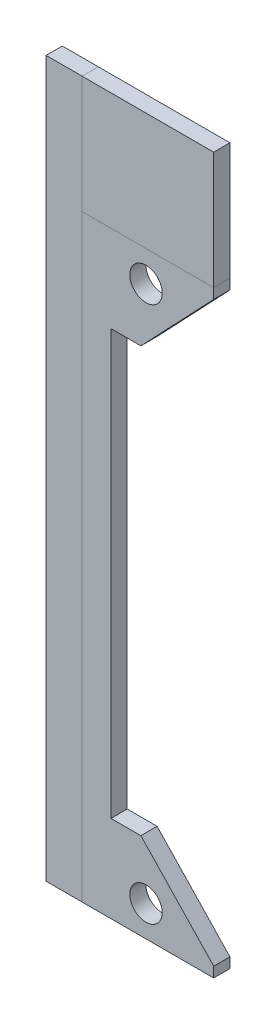
ISO-10303-21;
HEADER;
FILE_DESCRIPTION(('STEP AP214'),'2;1');
FILE_NAME('part.step','',(''),(''),'','','');
FILE_SCHEMA(('AUTOMOTIVE_DESIGN { 1 0 10303 214 1 1 1 1 }'));
ENDSEC;
DATA;
#1=APPLICATION_CONTEXT('core data for automotive mechanical design processes');
#2=APPLICATION_PROTOCOL_DEFINITION('international standard','automotive_design',2000,#1);
#3=PRODUCT_CONTEXT('',#1,'mechanical');
#4=PRODUCT('Part','Part','',(#3));
#5=PRODUCT_RELATED_PRODUCT_CATEGORY('part','',(#4));
#6=PRODUCT_DEFINITION_FORMATION('','',#4);
#7=PRODUCT_DEFINITION_CONTEXT('part definition',#1,'design');
#8=PRODUCT_DEFINITION('design','',#6,#7);
#9=PRODUCT_DEFINITION_SHAPE('','',#8);
#10=(LENGTH_UNIT() NAMED_UNIT(*) SI_UNIT(.MILLI.,.METRE.));
#11=(NAMED_UNIT(*) PLANE_ANGLE_UNIT() SI_UNIT($,.RADIAN.));
#12=(NAMED_UNIT(*) SI_UNIT($,.STERADIAN.) SOLID_ANGLE_UNIT());
#13=UNCERTAINTY_MEASURE_WITH_UNIT(LENGTH_MEASURE(1.E-05),#10,'distance_accuracy_value','');
#14=(GEOMETRIC_REPRESENTATION_CONTEXT(3) GLOBAL_UNCERTAINTY_ASSIGNED_CONTEXT((#13)) GLOBAL_UNIT_ASSIGNED_CONTEXT((#10,
#11,#12)) REPRESENTATION_CONTEXT('',''));
#15=CARTESIAN_POINT('',(0.,0.,0.));
#16=DIRECTION('',(0.,0.,1.));
#17=DIRECTION('',(1.,0.,0.));
#18=AXIS2_PLACEMENT_3D('',#15,#16,#17);
#19=CARTESIAN_POINT('',(0.,0.,3.17499999999992));
#20=DIRECTION('',(0.,0.,-1.));
#21=DIRECTION('',(-1.,0.,0.));
#22=AXIS2_PLACEMENT_3D('',#19,#20,#21);
#23=PLANE('',#22);
#24=DIRECTION('',(0.,1.,0.));
#25=VECTOR('',#24,1.);
#26=CARTESIAN_POINT('',(-490.,1.49999999999986,3.17499999999997));
#27=LINE('',#26,#25);
#28=CARTESIAN_POINT('',(-490.,1.49999999999986,3.17499999999997));
#29=VERTEX_POINT('',#28);
#30=CARTESIAN_POINT('',(-490.,141.459761952969,3.17499999999996));
#31=VERTEX_POINT('',#30);
#32=EDGE_CURVE('E240',#29,#31,#27,.T.);
#33=ORIENTED_EDGE('',*,*,#32,.T.);
#34=DIRECTION('',(-1.,0.,0.));
#35=VECTOR('',#34,1.);
#36=CARTESIAN_POINT('',(-490.,141.459761952969,3.17499999999996));
#37=LINE('',#36,#35);
#38=CARTESIAN_POINT('',(-497.05,141.459761952969,3.17499999999988));
#39=VERTEX_POINT('',#38);
#40=EDGE_CURVE('E246',#31,#39,#37,.T.);
#41=ORIENTED_EDGE('',*,*,#40,.T.);
#42=DIRECTION('',(0.,1.,0.));
#43=VECTOR('',#42,1.);
#44=CARTESIAN_POINT('',(-497.05,1.49999999999986,3.17499999999995));
#45=LINE('',#44,#43);
#46=CARTESIAN_POINT('',(-497.05,1.49999999999986,3.17499999999995));
#47=VERTEX_POINT('',#46);
#48=EDGE_CURVE('E270',#47,#39,#45,.T.);
#49=ORIENTED_EDGE('',*,*,#48,.F.);
#50=DIRECTION('',(-1.,0.,0.));
#51=VECTOR('',#50,1.);
#52=CARTESIAN_POINT('',(-490.,1.49999999999986,3.17499999999997));
#53=LINE('',#52,#51);
#54=EDGE_CURVE('E220',#29,#47,#53,.T.);
#55=ORIENTED_EDGE('',*,*,#54,.F.);
#56=EDGE_LOOP('',(#33,#41,#49,#55));
#57=FACE_BOUND('',#56,.T.);
#58=ADVANCED_FACE('F211',(#57),#23,.F.);
#59=CARTESIAN_POINT('',(0.,0.,0.));
#60=DIRECTION('',(0.,0.,-1.));
#61=DIRECTION('',(-1.,0.,0.));
#62=AXIS2_PLACEMENT_3D('',#59,#60,#61);
#63=PLANE('',#62);
#64=DIRECTION('',(0.,1.,0.));
#65=VECTOR('',#64,1.);
#66=CARTESIAN_POINT('',(-490.,1.49999999999986,0.));
#67=LINE('',#66,#65);
#68=CARTESIAN_POINT('',(-490.,1.49999999999986,0.));
#69=VERTEX_POINT('',#68);
#70=CARTESIAN_POINT('',(-490.,141.459761952969,0.));
#71=VERTEX_POINT('',#70);
#72=EDGE_CURVE('E228',#69,#71,#67,.T.);
#73=ORIENTED_EDGE('',*,*,#72,.F.);
#74=DIRECTION('',(-1.,0.,0.));
#75=VECTOR('',#74,1.);
#76=CARTESIAN_POINT('',(-490.,1.49999999999986,0.));
#77=LINE('',#76,#75);
#78=CARTESIAN_POINT('',(-497.05,1.49999999999986,0.));
#79=VERTEX_POINT('',#78);
#80=EDGE_CURVE('E13',#69,#79,#77,.T.);
#81=ORIENTED_EDGE('',*,*,#80,.T.);
#82=DIRECTION('',(0.,1.,0.));
#83=VECTOR('',#82,1.);
#84=CARTESIAN_POINT('',(-497.05,1.49999999999986,0.));
#85=LINE('',#84,#83);
#86=CARTESIAN_POINT('',(-497.05,141.459761952969,-1.19307173844465E-13));
#87=VERTEX_POINT('',#86);
#88=EDGE_CURVE('E255',#79,#87,#85,.T.);
#89=ORIENTED_EDGE('',*,*,#88,.T.);
#90=DIRECTION('',(-1.,0.,0.));
#91=VECTOR('',#90,1.);
#92=CARTESIAN_POINT('',(-490.,141.459761952969,0.));
#93=LINE('',#92,#91);
#94=EDGE_CURVE('E288',#71,#87,#93,.T.);
#95=ORIENTED_EDGE('',*,*,#94,.F.);
#96=EDGE_LOOP('',(#73,#81,#89,#95));
#97=FACE_BOUND('',#96,.T.);
#98=ADVANCED_FACE('F254',(#97),#63,.T.);
#99=CARTESIAN_POINT('',(-490.,1.49999999999986,0.));
#100=DIRECTION('',(1.,0.,0.));
#101=DIRECTION('',(0.,1.,0.));
#102=AXIS2_PLACEMENT_3D('',#99,#100,#101);
#103=PLANE('',#102);
#104=ORIENTED_EDGE('',*,*,#32,.F.);
#105=DIRECTION('',(0.,0.,1.));
#106=VECTOR('',#105,1.);
#107=CARTESIAN_POINT('',(-490.,1.49999999999986,0.));
#108=LINE('',#107,#106);
#109=EDGE_CURVE('E282',#69,#29,#108,.T.);
#110=ORIENTED_EDGE('',*,*,#109,.F.);
#111=ORIENTED_EDGE('',*,*,#72,.T.);
#112=DIRECTION('',(0.,0.,1.));
#113=VECTOR('',#112,1.);
#114=CARTESIAN_POINT('',(-490.,141.459761952969,0.));
#115=LINE('',#114,#113);
#116=EDGE_CURVE('E295',#71,#31,#115,.T.);
#117=ORIENTED_EDGE('',*,*,#116,.T.);
#118=EDGE_LOOP('',(#104,#110,#111,#117));
#119=FACE_BOUND('',#118,.T.);
#120=ADVANCED_FACE('F307',(#119),#103,.T.);
#121=CARTESIAN_POINT('',(-490.,141.459761952969,0.));
#122=DIRECTION('',(0.,1.,0.));
#123=DIRECTION('',(0.,0.,1.));
#124=AXIS2_PLACEMENT_3D('',#121,#122,#123);
#125=PLANE('',#124);
#126=ORIENTED_EDGE('',*,*,#40,.F.);
#127=ORIENTED_EDGE('',*,*,#116,.F.);
#128=ORIENTED_EDGE('',*,*,#94,.T.);
#129=DIRECTION('',(0.,0.,1.));
#130=VECTOR('',#129,1.);
#131=CARTESIAN_POINT('',(-497.05,141.459761952969,-1.19307173844465E-13));
#132=LINE('',#131,#130);
#133=EDGE_CURVE('E266',#87,#39,#132,.T.);
#134=ORIENTED_EDGE('',*,*,#133,.T.);
#135=EDGE_LOOP('',(#126,#127,#128,#134));
#136=FACE_BOUND('',#135,.T.);
#137=ADVANCED_FACE('F309',(#136),#125,.T.);
#138=CARTESIAN_POINT('',(-490.,1.49999999999986,0.));
#139=DIRECTION('',(0.,1.,0.));
#140=DIRECTION('',(0.,0.,1.));
#141=AXIS2_PLACEMENT_3D('',#138,#139,#140);
#142=PLANE('',#141);
#143=ORIENTED_EDGE('',*,*,#54,.T.);
#144=DIRECTION('',(0.,0.,1.));
#145=VECTOR('',#144,1.);
#146=CARTESIAN_POINT('',(-497.05,1.49999999999986,0.));
#147=LINE('',#146,#145);
#148=EDGE_CURVE('E264',#79,#47,#147,.T.);
#149=ORIENTED_EDGE('',*,*,#148,.F.);
#150=ORIENTED_EDGE('',*,*,#80,.F.);
#151=ORIENTED_EDGE('',*,*,#109,.T.);
#152=EDGE_LOOP('',(#143,#149,#150,#151));
#153=FACE_BOUND('',#152,.T.);
#154=ADVANCED_FACE('F269',(#153),#142,.F.);
#155=CARTESIAN_POINT('',(-497.05,1.49999999999986,0.));
#156=DIRECTION('',(1.,0.,0.));
#157=DIRECTION('',(0.,0.,-1.));
#158=AXIS2_PLACEMENT_3D('',#155,#156,#157);
#159=PLANE('',#158);
#160=ORIENTED_EDGE('',*,*,#48,.T.);
#161=ORIENTED_EDGE('',*,*,#133,.F.);
#162=ORIENTED_EDGE('',*,*,#88,.F.);
#163=ORIENTED_EDGE('',*,*,#148,.T.);
#164=EDGE_LOOP('',(#160,#161,#162,#163));
#165=FACE_BOUND('',#164,.T.);
#166=ADVANCED_FACE('F263',(#165),#159,.F.);
#167=CLOSED_SHELL('',(#58,#98,#120,#137,#154,#166));
#168=MANIFOLD_SOLID_BREP('B2',#167);
#169=CARTESIAN_POINT('',(0.,0.,3.17499999999997));
#170=DIRECTION('',(0.,0.,-1.));
#171=DIRECTION('',(-1.,0.,0.));
#172=AXIS2_PLACEMENT_3D('',#169,#170,#171);
#173=PLANE('',#172);
#174=DIRECTION('',(0.,1.,0.));
#175=VECTOR('',#174,1.);
#176=CARTESIAN_POINT('',(-490.,118.5,3.17499999999997));
#177=LINE('',#176,#175);
#178=CARTESIAN_POINT('',(-490.,118.5,3.17499999999997));
#179=VERTEX_POINT('',#178);
#180=CARTESIAN_POINT('',(-490.,141.459761952969,3.17499999999996));
#181=VERTEX_POINT('',#180);
#182=EDGE_CURVE('E408',#179,#181,#177,.T.);
#183=ORIENTED_EDGE('',*,*,#182,.F.);
#184=DIRECTION('',(1.,0.,0.));
#185=VECTOR('',#184,1.);
#186=CARTESIAN_POINT('',(-490.,118.5,3.17499999999997));
#187=LINE('',#186,#185);
#188=CARTESIAN_POINT('',(-464.25,118.5,3.17499999999997));
#189=VERTEX_POINT('',#188);
#190=EDGE_CURVE('E415',#179,#189,#187,.T.);
#191=ORIENTED_EDGE('',*,*,#190,.T.);
#192=DIRECTION('',(0.,1.,0.));
#193=VECTOR('',#192,1.);
#194=CARTESIAN_POINT('',(-464.25,118.5,3.17499999999997));
#195=LINE('',#194,#193);
#196=CARTESIAN_POINT('',(-464.25,141.459761952969,3.17499999999998));
#197=VERTEX_POINT('',#196);
#198=EDGE_CURVE('E440',#189,#197,#195,.T.);
#199=ORIENTED_EDGE('',*,*,#198,.T.);
#200=DIRECTION('',(1.,0.,0.));
#201=VECTOR('',#200,1.);
#202=CARTESIAN_POINT('',(-490.,141.459761952969,3.17499999999996));
#203=LINE('',#202,#201);
#204=EDGE_CURVE('E377',#181,#197,#203,.T.);
#205=ORIENTED_EDGE('',*,*,#204,.F.);
#206=EDGE_LOOP('',(#183,#191,#199,#205));
#207=FACE_BOUND('',#206,.T.);
#208=ADVANCED_FACE('F368',(#207),#173,.F.);
#209=CARTESIAN_POINT('',(0.,0.,0.));
#210=DIRECTION('',(0.,0.,-1.));
#211=DIRECTION('',(-1.,0.,0.));
#212=AXIS2_PLACEMENT_3D('',#209,#210,#211);
#213=PLANE('',#212);
#214=DIRECTION('',(0.,1.,0.));
#215=VECTOR('',#214,1.);
#216=CARTESIAN_POINT('',(-490.,118.5,0.));
#217=LINE('',#216,#215);
#218=CARTESIAN_POINT('',(-490.,118.5,0.));
#219=VERTEX_POINT('',#218);
#220=CARTESIAN_POINT('',(-490.,141.459761952969,0.));
#221=VERTEX_POINT('',#220);
#222=EDGE_CURVE('E427',#219,#221,#217,.T.);
#223=ORIENTED_EDGE('',*,*,#222,.T.);
#224=DIRECTION('',(1.,0.,0.));
#225=VECTOR('',#224,1.);
#226=CARTESIAN_POINT('',(-490.,141.459761952969,0.));
#227=LINE('',#226,#225);
#228=CARTESIAN_POINT('',(-464.25,141.459761952969,0.));
#229=VERTEX_POINT('',#228);
#230=EDGE_CURVE('E209',#221,#229,#227,.T.);
#231=ORIENTED_EDGE('',*,*,#230,.T.);
#232=DIRECTION('',(0.,1.,0.));
#233=VECTOR('',#232,1.);
#234=CARTESIAN_POINT('',(-464.25,118.5,0.));
#235=LINE('',#234,#233);
#236=CARTESIAN_POINT('',(-464.25,118.5,0.));
#237=VERTEX_POINT('',#236);
#238=EDGE_CURVE('E386',#237,#229,#235,.T.);
#239=ORIENTED_EDGE('',*,*,#238,.F.);
#240=DIRECTION('',(1.,0.,0.));
#241=VECTOR('',#240,1.);
#242=CARTESIAN_POINT('',(-490.,118.5,0.));
#243=LINE('',#242,#241);
#244=EDGE_CURVE('E422',#219,#237,#243,.T.);
#245=ORIENTED_EDGE('',*,*,#244,.F.);
#246=EDGE_LOOP('',(#223,#231,#239,#245));
#247=FACE_BOUND('',#246,.T.);
#248=ADVANCED_FACE('F452',(#247),#213,.T.);
#249=CARTESIAN_POINT('',(-490.,118.5,0.));
#250=DIRECTION('',(1.,0.,0.));
#251=DIRECTION('',(0.,0.,-1.));
#252=AXIS2_PLACEMENT_3D('',#249,#250,#251);
#253=PLANE('',#252);
#254=ORIENTED_EDGE('',*,*,#182,.T.);
#255=DIRECTION('',(0.,0.,1.));
#256=VECTOR('',#255,1.);
#257=CARTESIAN_POINT('',(-490.,141.459761952969,0.));
#258=LINE('',#257,#256);
#259=EDGE_CURVE('E423',#221,#181,#258,.T.);
#260=ORIENTED_EDGE('',*,*,#259,.F.);
#261=ORIENTED_EDGE('',*,*,#222,.F.);
#262=DIRECTION('',(0.,0.,1.));
#263=VECTOR('',#262,1.);
#264=CARTESIAN_POINT('',(-490.,118.5,0.));
#265=LINE('',#264,#263);
#266=EDGE_CURVE('E417',#219,#179,#265,.T.);
#267=ORIENTED_EDGE('',*,*,#266,.T.);
#268=EDGE_LOOP('',(#254,#260,#261,#267));
#269=FACE_BOUND('',#268,.T.);
#270=ADVANCED_FACE('F425',(#269),#253,.F.);
#271=CARTESIAN_POINT('',(-490.,141.459761952969,0.));
#272=DIRECTION('',(0.,-1.,0.));
#273=DIRECTION('',(0.,0.,-1.));
#274=AXIS2_PLACEMENT_3D('',#271,#272,#273);
#275=PLANE('',#274);
#276=ORIENTED_EDGE('',*,*,#204,.T.);
#277=DIRECTION('',(0.,0.,1.));
#278=VECTOR('',#277,1.);
#279=CARTESIAN_POINT('',(-464.25,141.459761952969,0.));
#280=LINE('',#279,#278);
#281=EDGE_CURVE('E437',#229,#197,#280,.T.);
#282=ORIENTED_EDGE('',*,*,#281,.F.);
#283=ORIENTED_EDGE('',*,*,#230,.F.);
#284=ORIENTED_EDGE('',*,*,#259,.T.);
#285=EDGE_LOOP('',(#276,#282,#283,#284));
#286=FACE_BOUND('',#285,.T.);
#287=ADVANCED_FACE('F466',(#286),#275,.F.);
#288=CARTESIAN_POINT('',(-490.,118.5,0.));
#289=DIRECTION('',(0.,-1.,0.));
#290=DIRECTION('',(1.,0.,0.));
#291=AXIS2_PLACEMENT_3D('',#288,#289,#290);
#292=PLANE('',#291);
#293=ORIENTED_EDGE('',*,*,#190,.F.);
#294=ORIENTED_EDGE('',*,*,#266,.F.);
#295=ORIENTED_EDGE('',*,*,#244,.T.);
#296=DIRECTION('',(0.,0.,1.));
#297=VECTOR('',#296,1.);
#298=CARTESIAN_POINT('',(-464.25,118.5,0.));
#299=LINE('',#298,#297);
#300=EDGE_CURVE('E419',#237,#189,#299,.T.);
#301=ORIENTED_EDGE('',*,*,#300,.T.);
#302=EDGE_LOOP('',(#293,#294,#295,#301));
#303=FACE_BOUND('',#302,.T.);
#304=ADVANCED_FACE('F416',(#303),#292,.T.);
#305=CARTESIAN_POINT('',(-464.25,118.5,0.));
#306=DIRECTION('',(1.,0.,0.));
#307=DIRECTION('',(0.,0.,-1.));
#308=AXIS2_PLACEMENT_3D('',#305,#306,#307);
#309=PLANE('',#308);
#310=ORIENTED_EDGE('',*,*,#198,.F.);
#311=ORIENTED_EDGE('',*,*,#300,.F.);
#312=ORIENTED_EDGE('',*,*,#238,.T.);
#313=ORIENTED_EDGE('',*,*,#281,.T.);
#314=EDGE_LOOP('',(#310,#311,#312,#313));
#315=FACE_BOUND('',#314,.T.);
#316=ADVANCED_FACE('F454',(#315),#309,.T.);
#317=CLOSED_SHELL('',(#208,#248,#270,#287,#304,#316));
#318=MANIFOLD_SOLID_BREP('B7',#317);
#319=CARTESIAN_POINT('',(0.,0.,3.17499999999997));
#320=DIRECTION('',(0.,0.,-1.));
#321=DIRECTION('',(-1.,0.,0.));
#322=AXIS2_PLACEMENT_3D('',#319,#320,#321);
#323=PLANE('',#322);
#324=CARTESIAN_POINT('',(-477.5,7.49999999999986,3.17499999999997));
#325=DIRECTION('',(0.,0.,1.));
#326=DIRECTION('',(1.,0.,0.));
#327=AXIS2_PLACEMENT_3D('',#324,#325,#326);
#328=CIRCLE('',#327,3.17499999999997);
#329=CARTESIAN_POINT('',(-474.325,7.49999999999986,3.17499999999997));
#330=VERTEX_POINT('',#329);
#331=EDGE_CURVE('E744',#330,#330,#328,.T.);
#332=ORIENTED_EDGE('',*,*,#331,.F.);
#333=EDGE_LOOP('',(#332));
#334=FACE_BOUND('',#333,.T.);
#335=CARTESIAN_POINT('',(-477.5,112.5,3.17499999999997));
#336=DIRECTION('',(0.,0.,1.));
#337=DIRECTION('',(1.,0.,0.));
#338=AXIS2_PLACEMENT_3D('',#335,#336,#337);
#339=CIRCLE('',#338,3.17499999999997);
#340=CARTESIAN_POINT('',(-474.325,112.5,3.17499999999997));
#341=VERTEX_POINT('',#340);
#342=EDGE_CURVE('E722',#341,#341,#339,.T.);
#343=ORIENTED_EDGE('',*,*,#342,.F.);
#344=EDGE_LOOP('',(#343));
#345=FACE_BOUND('',#344,.T.);
#346=DIRECTION('',(0.688749461914693,0.724999433594414,0.));
#347=VECTOR('',#346,1.);
#348=CARTESIAN_POINT('',(-478.5,101.5,3.17499999999997));
#349=LINE('',#348,#347);
#350=CARTESIAN_POINT('',(-478.5,101.5,3.17499999999997));
#351=VERTEX_POINT('',#350);
#352=CARTESIAN_POINT('',(-464.25,116.5,3.17499999999997));
#353=VERTEX_POINT('',#352);
#354=EDGE_CURVE('E525',#351,#353,#349,.T.);
#355=ORIENTED_EDGE('',*,*,#354,.T.);
#356=DIRECTION('',(0.,1.,0.));
#357=VECTOR('',#356,1.);
#358=CARTESIAN_POINT('',(-464.25,116.5,3.17499999999997));
#359=LINE('',#358,#357);
#360=CARTESIAN_POINT('',(-464.25,118.5,3.17499999999999));
#361=VERTEX_POINT('',#360);
#362=EDGE_CURVE('E610',#353,#361,#359,.T.);
#363=ORIENTED_EDGE('',*,*,#362,.T.);
#364=DIRECTION('',(-1.,0.,0.));
#365=VECTOR('',#364,1.);
#366=CARTESIAN_POINT('',(-464.25,118.5,3.17499999999999));
#367=LINE('',#366,#365);
#368=CARTESIAN_POINT('',(-490.,118.5,3.17499999999997));
#369=VERTEX_POINT('',#368);
#370=EDGE_CURVE('E635',#361,#369,#367,.T.);
#371=ORIENTED_EDGE('',*,*,#370,.T.);
#372=DIRECTION('',(0.,-1.,0.));
#373=VECTOR('',#372,1.);
#374=CARTESIAN_POINT('',(-490.,118.5,3.17499999999997));
#375=LINE('',#374,#373);
#376=CARTESIAN_POINT('',(-490.,1.49999999999987,3.17499999999997));
#377=VERTEX_POINT('',#376);
#378=EDGE_CURVE('E647',#369,#377,#375,.T.);
#379=ORIENTED_EDGE('',*,*,#378,.T.);
#380=DIRECTION('',(1.,0.,0.));
#381=VECTOR('',#380,1.);
#382=CARTESIAN_POINT('',(-490.,1.49999999999986,3.17499999999997));
#383=LINE('',#382,#381);
#384=CARTESIAN_POINT('',(-464.25,1.49999999999986,3.17499999999997));
#385=VERTEX_POINT('',#384);
#386=EDGE_CURVE('E661',#377,#385,#383,.T.);
#387=ORIENTED_EDGE('',*,*,#386,.T.);
#388=DIRECTION('',(0.,-1.,0.));
#389=VECTOR('',#388,1.);
#390=CARTESIAN_POINT('',(-464.25,3.49999999999986,3.17499999999997));
#391=LINE('',#390,#389);
#392=CARTESIAN_POINT('',(-464.25,3.49999999999986,3.17499999999997));
#393=VERTEX_POINT('',#392);
#394=EDGE_CURVE('E674',#393,#385,#391,.T.);
#395=ORIENTED_EDGE('',*,*,#394,.F.);
#396=DIRECTION('',(-0.688749461914693,0.724999433594414,0.));
#397=VECTOR('',#396,1.);
#398=CARTESIAN_POINT('',(-464.25,3.49999999999986,3.17499999999997));
#399=LINE('',#398,#397);
#400=CARTESIAN_POINT('',(-478.5,18.4999999999999,3.17499999999997));
#401=VERTEX_POINT('',#400);
#402=EDGE_CURVE('E563',#393,#401,#399,.T.);
#403=ORIENTED_EDGE('',*,*,#402,.T.);
#404=DIRECTION('',(-1.,0.,0.));
#405=VECTOR('',#404,1.);
#406=CARTESIAN_POINT('',(-478.5,18.4999999999999,3.17499999999997));
#407=LINE('',#406,#405);
#408=CARTESIAN_POINT('',(-484.35,18.4999999999999,3.17499999999997));
#409=VERTEX_POINT('',#408);
#410=EDGE_CURVE('E557',#401,#409,#407,.T.);
#411=ORIENTED_EDGE('',*,*,#410,.T.);
#412=DIRECTION('',(0.,1.,0.));
#413=VECTOR('',#412,1.);
#414=CARTESIAN_POINT('',(-484.35,18.4999999999999,3.17499999999997));
#415=LINE('',#414,#413);
#416=CARTESIAN_POINT('',(-484.35,101.5,3.17499999999997));
#417=VERTEX_POINT('',#416);
#418=EDGE_CURVE('E552',#409,#417,#415,.T.);
#419=ORIENTED_EDGE('',*,*,#418,.T.);
#420=DIRECTION('',(1.,0.,0.));
#421=VECTOR('',#420,1.);
#422=CARTESIAN_POINT('',(-484.35,101.5,3.17499999999997));
#423=LINE('',#422,#421);
#424=EDGE_CURVE('E546',#417,#351,#423,.T.);
#425=ORIENTED_EDGE('',*,*,#424,.T.);
#426=EDGE_LOOP('',(#355,#363,#371,#379,#387,#395,#403,#411,#419,#425));
#427=FACE_BOUND('',#426,.T.);
#428=ADVANCED_FACE('F516',(#334,#345,#427),#323,.F.);
#429=CARTESIAN_POINT('',(0.,0.,0.));
#430=DIRECTION('',(0.,0.,-1.));
#431=DIRECTION('',(-1.,0.,0.));
#432=AXIS2_PLACEMENT_3D('',#429,#430,#431);
#433=PLANE('',#432);
#434=CARTESIAN_POINT('',(-477.5,7.49999999999986,0.));
#435=DIRECTION('',(0.,0.,1.));
#436=DIRECTION('',(1.,0.,0.));
#437=AXIS2_PLACEMENT_3D('',#434,#435,#436);
#438=CIRCLE('',#437,3.17499999999997);
#439=CARTESIAN_POINT('',(-474.325,7.49999999999986,0.));
#440=VERTEX_POINT('',#439);
#441=EDGE_CURVE('E747',#440,#440,#438,.T.);
#442=ORIENTED_EDGE('',*,*,#441,.T.);
#443=EDGE_LOOP('',(#442));
#444=FACE_BOUND('',#443,.T.);
#445=CARTESIAN_POINT('',(-477.5,112.5,0.));
#446=DIRECTION('',(0.,0.,1.));
#447=DIRECTION('',(1.,0.,0.));
#448=AXIS2_PLACEMENT_3D('',#445,#446,#447);
#449=CIRCLE('',#448,3.17499999999997);
#450=CARTESIAN_POINT('',(-474.325,112.5,0.));
#451=VERTEX_POINT('',#450);
#452=EDGE_CURVE('E725',#451,#451,#449,.T.);
#453=ORIENTED_EDGE('',*,*,#452,.T.);
#454=EDGE_LOOP('',(#453));
#455=FACE_BOUND('',#454,.T.);
#456=DIRECTION('',(0.688749461914693,0.724999433594414,0.));
#457=VECTOR('',#456,1.);
#458=CARTESIAN_POINT('',(-478.5,101.5,0.));
#459=LINE('',#458,#457);
#460=CARTESIAN_POINT('',(-478.5,101.5,0.));
#461=VERTEX_POINT('',#460);
#462=CARTESIAN_POINT('',(-464.25,116.5,0.));
#463=VERTEX_POINT('',#462);
#464=EDGE_CURVE('E366',#461,#463,#459,.T.);
#465=ORIENTED_EDGE('',*,*,#464,.F.);
#466=DIRECTION('',(1.,0.,0.));
#467=VECTOR('',#466,1.);
#468=CARTESIAN_POINT('',(-484.35,101.5,0.));
#469=LINE('',#468,#467);
#470=CARTESIAN_POINT('',(-484.35,101.5,0.));
#471=VERTEX_POINT('',#470);
#472=EDGE_CURVE('E717',#471,#461,#469,.T.);
#473=ORIENTED_EDGE('',*,*,#472,.F.);
#474=DIRECTION('',(0.,1.,0.));
#475=VECTOR('',#474,1.);
#476=CARTESIAN_POINT('',(-484.35,18.4999999999999,0.));
#477=LINE('',#476,#475);
#478=CARTESIAN_POINT('',(-484.35,18.4999999999999,0.));
#479=VERTEX_POINT('',#478);
#480=EDGE_CURVE('E572',#479,#471,#477,.T.);
#481=ORIENTED_EDGE('',*,*,#480,.F.);
#482=DIRECTION('',(-1.,0.,0.));
#483=VECTOR('',#482,1.);
#484=CARTESIAN_POINT('',(-478.5,18.4999999999999,0.));
#485=LINE('',#484,#483);
#486=CARTESIAN_POINT('',(-478.5,18.4999999999999,0.));
#487=VERTEX_POINT('',#486);
#488=EDGE_CURVE('E577',#487,#479,#485,.T.);
#489=ORIENTED_EDGE('',*,*,#488,.F.);
#490=DIRECTION('',(-0.688749461914693,0.724999433594414,0.));
#491=VECTOR('',#490,1.);
#492=CARTESIAN_POINT('',(-464.25,3.49999999999986,0.));
#493=LINE('',#492,#491);
#494=CARTESIAN_POINT('',(-464.25,3.49999999999986,0.));
#495=VERTEX_POINT('',#494);
#496=EDGE_CURVE('E583',#495,#487,#493,.T.);
#497=ORIENTED_EDGE('',*,*,#496,.F.);
#498=DIRECTION('',(0.,-1.,0.));
#499=VECTOR('',#498,1.);
#500=CARTESIAN_POINT('',(-464.25,3.49999999999986,0.));
#501=LINE('',#500,#499);
#502=CARTESIAN_POINT('',(-464.25,1.49999999999986,0.));
#503=VERTEX_POINT('',#502);
#504=EDGE_CURVE('E672',#495,#503,#501,.T.);
#505=ORIENTED_EDGE('',*,*,#504,.T.);
#506=DIRECTION('',(1.,0.,0.));
#507=VECTOR('',#506,1.);
#508=CARTESIAN_POINT('',(-490.,1.49999999999986,0.));
#509=LINE('',#508,#507);
#510=CARTESIAN_POINT('',(-490.,1.49999999999987,0.));
#511=VERTEX_POINT('',#510);
#512=EDGE_CURVE('E655',#511,#503,#509,.T.);
#513=ORIENTED_EDGE('',*,*,#512,.F.);
#514=DIRECTION('',(0.,-1.,0.));
#515=VECTOR('',#514,1.);
#516=CARTESIAN_POINT('',(-490.,118.5,0.));
#517=LINE('',#516,#515);
#518=CARTESIAN_POINT('',(-490.,118.5,0.));
#519=VERTEX_POINT('',#518);
#520=EDGE_CURVE('E641',#519,#511,#517,.T.);
#521=ORIENTED_EDGE('',*,*,#520,.F.);
#522=DIRECTION('',(-1.,0.,0.));
#523=VECTOR('',#522,1.);
#524=CARTESIAN_POINT('',(-464.25,118.5,0.));
#525=LINE('',#524,#523);
#526=CARTESIAN_POINT('',(-464.25,118.5,0.));
#527=VERTEX_POINT('',#526);
#528=EDGE_CURVE('E625',#527,#519,#525,.T.);
#529=ORIENTED_EDGE('',*,*,#528,.F.);
#530=DIRECTION('',(0.,1.,0.));
#531=VECTOR('',#530,1.);
#532=CARTESIAN_POINT('',(-464.25,116.5,0.));
#533=LINE('',#532,#531);
#534=EDGE_CURVE('E613',#463,#527,#533,.T.);
#535=ORIENTED_EDGE('',*,*,#534,.F.);
#536=EDGE_LOOP('',(#465,#473,#481,#489,#497,#505,#513,#521,#529,#535));
#537=FACE_BOUND('',#536,.T.);
#538=ADVANCED_FACE('F751',(#444,#455,#537),#433,.T.);
#539=CARTESIAN_POINT('',(-484.35,101.5,0.));
#540=DIRECTION('',(0.,-1.,0.));
#541=DIRECTION('',(0.,0.,-1.));
#542=AXIS2_PLACEMENT_3D('',#539,#540,#541);
#543=PLANE('',#542);
#544=ORIENTED_EDGE('',*,*,#424,.F.);
#545=DIRECTION('',(0.,0.,1.));
#546=VECTOR('',#545,1.);
#547=CARTESIAN_POINT('',(-484.35,101.5,0.));
#548=LINE('',#547,#546);
#549=EDGE_CURVE('E716',#471,#417,#548,.T.);
#550=ORIENTED_EDGE('',*,*,#549,.F.);
#551=ORIENTED_EDGE('',*,*,#472,.T.);
#552=DIRECTION('',(0.,0.,1.));
#553=VECTOR('',#552,1.);
#554=CARTESIAN_POINT('',(-478.5,101.5,0.));
#555=LINE('',#554,#553);
#556=EDGE_CURVE('E714',#461,#351,#555,.T.);
#557=ORIENTED_EDGE('',*,*,#556,.T.);
#558=EDGE_LOOP('',(#544,#550,#551,#557));
#559=FACE_BOUND('',#558,.T.);
#560=ADVANCED_FACE('F776',(#559),#543,.T.);
#561=CARTESIAN_POINT('',(-484.35,18.4999999999999,0.));
#562=DIRECTION('',(1.,0.,0.));
#563=DIRECTION('',(0.,1.,0.));
#564=AXIS2_PLACEMENT_3D('',#561,#562,#563);
#565=PLANE('',#564);
#566=ORIENTED_EDGE('',*,*,#418,.F.);
#567=DIRECTION('',(0.,0.,1.));
#568=VECTOR('',#567,1.);
#569=CARTESIAN_POINT('',(-484.35,18.4999999999999,0.));
#570=LINE('',#569,#568);
#571=EDGE_CURVE('E706',#479,#409,#570,.T.);
#572=ORIENTED_EDGE('',*,*,#571,.F.);
#573=ORIENTED_EDGE('',*,*,#480,.T.);
#574=ORIENTED_EDGE('',*,*,#549,.T.);
#575=EDGE_LOOP('',(#566,#572,#573,#574));
#576=FACE_BOUND('',#575,.T.);
#577=ADVANCED_FACE('F779',(#576),#565,.T.);
#578=CARTESIAN_POINT('',(-478.5,18.4999999999999,0.));
#579=DIRECTION('',(0.,1.,0.));
#580=DIRECTION('',(-1.,0.,0.));
#581=AXIS2_PLACEMENT_3D('',#578,#579,#580);
#582=PLANE('',#581);
#583=ORIENTED_EDGE('',*,*,#410,.F.);
#584=DIRECTION('',(0.,0.,1.));
#585=VECTOR('',#584,1.);
#586=CARTESIAN_POINT('',(-478.5,18.4999999999999,0.));
#587=LINE('',#586,#585);
#588=EDGE_CURVE('E696',#487,#401,#587,.T.);
#589=ORIENTED_EDGE('',*,*,#588,.F.);
#590=ORIENTED_EDGE('',*,*,#488,.T.);
#591=ORIENTED_EDGE('',*,*,#571,.T.);
#592=EDGE_LOOP('',(#583,#589,#590,#591));
#593=FACE_BOUND('',#592,.T.);
#594=ADVANCED_FACE('F783',(#593),#582,.T.);
#595=CARTESIAN_POINT('',(-464.25,3.49999999999986,0.));
#596=DIRECTION('',(0.724999433594414,0.688749461914693,0.));
#597=DIRECTION('',(-0.688749461914693,0.724999433594414,0.));
#598=AXIS2_PLACEMENT_3D('',#595,#596,#597);
#599=PLANE('',#598);
#600=ORIENTED_EDGE('',*,*,#402,.F.);
#601=DIRECTION('',(0.,0.,1.));
#602=VECTOR('',#601,1.);
#603=CARTESIAN_POINT('',(-464.25,3.49999999999986,0.));
#604=LINE('',#603,#602);
#605=EDGE_CURVE('E685',#495,#393,#604,.T.);
#606=ORIENTED_EDGE('',*,*,#605,.F.);
#607=ORIENTED_EDGE('',*,*,#496,.T.);
#608=ORIENTED_EDGE('',*,*,#588,.T.);
#609=EDGE_LOOP('',(#600,#606,#607,#608));
#610=FACE_BOUND('',#609,.T.);
#611=ADVANCED_FACE('F786',(#610),#599,.T.);
#612=CARTESIAN_POINT('',(-490.,1.49999999999986,0.));
#613=DIRECTION('',(0.,-1.,0.));
#614=DIRECTION('',(1.,0.,0.));
#615=AXIS2_PLACEMENT_3D('',#612,#613,#614);
#616=PLANE('',#615);
#617=ORIENTED_EDGE('',*,*,#386,.F.);
#618=DIRECTION('',(0.,0.,1.));
#619=VECTOR('',#618,1.);
#620=CARTESIAN_POINT('',(-490.,1.49999999999986,0.));
#621=LINE('',#620,#619);
#622=EDGE_CURVE('E658',#511,#377,#621,.T.);
#623=ORIENTED_EDGE('',*,*,#622,.F.);
#624=ORIENTED_EDGE('',*,*,#512,.T.);
#625=DIRECTION('',(0.,0.,1.));
#626=VECTOR('',#625,1.);
#627=CARTESIAN_POINT('',(-464.25,1.49999999999986,0.));
#628=LINE('',#627,#626);
#629=EDGE_CURVE('E669',#503,#385,#628,.T.);
#630=ORIENTED_EDGE('',*,*,#629,.T.);
#631=EDGE_LOOP('',(#617,#623,#624,#630));
#632=FACE_BOUND('',#631,.T.);
#633=ADVANCED_FACE('F789',(#632),#616,.T.);
#634=CARTESIAN_POINT('',(-490.,118.5,0.));
#635=DIRECTION('',(-1.,0.,0.));
#636=DIRECTION('',(0.,-1.,0.));
#637=AXIS2_PLACEMENT_3D('',#634,#635,#636);
#638=PLANE('',#637);
#639=ORIENTED_EDGE('',*,*,#378,.F.);
#640=DIRECTION('',(0.,0.,1.));
#641=VECTOR('',#640,1.);
#642=CARTESIAN_POINT('',(-490.,118.5,0.));
#643=LINE('',#642,#641);
#644=EDGE_CURVE('E644',#519,#369,#643,.T.);
#645=ORIENTED_EDGE('',*,*,#644,.F.);
#646=ORIENTED_EDGE('',*,*,#520,.T.);
#647=ORIENTED_EDGE('',*,*,#622,.T.);
#648=EDGE_LOOP('',(#639,#645,#646,#647));
#649=FACE_BOUND('',#648,.T.);
#650=ADVANCED_FACE('F794',(#649),#638,.T.);
#651=CARTESIAN_POINT('',(-464.25,118.5,0.));
#652=DIRECTION('',(0.,1.,0.));
#653=DIRECTION('',(-1.,0.,0.));
#654=AXIS2_PLACEMENT_3D('',#651,#652,#653);
#655=PLANE('',#654);
#656=ORIENTED_EDGE('',*,*,#370,.F.);
#657=DIRECTION('',(0.,0.,1.));
#658=VECTOR('',#657,1.);
#659=CARTESIAN_POINT('',(-464.25,118.5,0.));
#660=LINE('',#659,#658);
#661=EDGE_CURVE('E623',#527,#361,#660,.T.);
#662=ORIENTED_EDGE('',*,*,#661,.F.);
#663=ORIENTED_EDGE('',*,*,#528,.T.);
#664=ORIENTED_EDGE('',*,*,#644,.T.);
#665=EDGE_LOOP('',(#656,#662,#663,#664));
#666=FACE_BOUND('',#665,.T.);
#667=ADVANCED_FACE('F798',(#666),#655,.T.);
#668=CARTESIAN_POINT('',(-464.25,116.5,0.));
#669=DIRECTION('',(1.,0.,0.));
#670=DIRECTION('',(0.,0.,-1.));
#671=AXIS2_PLACEMENT_3D('',#668,#669,#670);
#672=PLANE('',#671);
#673=ORIENTED_EDGE('',*,*,#362,.F.);
#674=DIRECTION('',(0.,0.,1.));
#675=VECTOR('',#674,1.);
#676=CARTESIAN_POINT('',(-464.25,116.5,0.));
#677=LINE('',#676,#675);
#678=EDGE_CURVE('E616',#463,#353,#677,.T.);
#679=ORIENTED_EDGE('',*,*,#678,.F.);
#680=ORIENTED_EDGE('',*,*,#534,.T.);
#681=ORIENTED_EDGE('',*,*,#661,.T.);
#682=EDGE_LOOP('',(#673,#679,#680,#681));
#683=FACE_BOUND('',#682,.T.);
#684=ADVANCED_FACE('F621',(#683),#672,.T.);
#685=CARTESIAN_POINT('',(-478.5,101.5,0.));
#686=DIRECTION('',(0.724999433594414,-0.688749461914693,0.));
#687=DIRECTION('',(0.688749461914693,0.724999433594414,0.));
#688=AXIS2_PLACEMENT_3D('',#685,#686,#687);
#689=PLANE('',#688);
#690=ORIENTED_EDGE('',*,*,#354,.F.);
#691=ORIENTED_EDGE('',*,*,#556,.F.);
#692=ORIENTED_EDGE('',*,*,#464,.T.);
#693=ORIENTED_EDGE('',*,*,#678,.T.);
#694=EDGE_LOOP('',(#690,#691,#692,#693));
#695=FACE_BOUND('',#694,.T.);
#696=ADVANCED_FACE('F617',(#695),#689,.T.);
#697=CARTESIAN_POINT('',(-464.25,3.49999999999986,0.));
#698=DIRECTION('',(-1.,0.,0.));
#699=DIRECTION('',(0.,0.,1.));
#700=AXIS2_PLACEMENT_3D('',#697,#698,#699);
#701=PLANE('',#700);
#702=ORIENTED_EDGE('',*,*,#394,.T.);
#703=ORIENTED_EDGE('',*,*,#629,.F.);
#704=ORIENTED_EDGE('',*,*,#504,.F.);
#705=ORIENTED_EDGE('',*,*,#605,.T.);
#706=EDGE_LOOP('',(#702,#703,#704,#705));
#707=FACE_BOUND('',#706,.T.);
#708=ADVANCED_FACE('F766',(#707),#701,.F.);
#709=CARTESIAN_POINT('',(-477.5,112.5,0.));
#710=DIRECTION('',(0.,0.,1.));
#711=DIRECTION('',(1.,0.,0.));
#712=AXIS2_PLACEMENT_3D('',#709,#710,#711);
#713=CYLINDRICAL_SURFACE('',#712,3.17499999999997);
#714=ORIENTED_EDGE('',*,*,#452,.F.);
#715=EDGE_LOOP('',(#714));
#716=FACE_BOUND('',#715,.T.);
#717=ORIENTED_EDGE('',*,*,#342,.T.);
#718=EDGE_LOOP('',(#717));
#719=FACE_BOUND('',#718,.T.);
#720=ADVANCED_FACE('F757',(#716,#719),#713,.F.);
#721=CARTESIAN_POINT('',(-477.5,7.49999999999986,0.));
#722=DIRECTION('',(0.,0.,1.));
#723=DIRECTION('',(1.,0.,0.));
#724=AXIS2_PLACEMENT_3D('',#721,#722,#723);
#725=CYLINDRICAL_SURFACE('',#724,3.17499999999997);
#726=ORIENTED_EDGE('',*,*,#441,.F.);
#727=EDGE_LOOP('',(#726));
#728=FACE_BOUND('',#727,.T.);
#729=ORIENTED_EDGE('',*,*,#331,.T.);
#730=EDGE_LOOP('',(#729));
#731=FACE_BOUND('',#730,.T.);
#732=ADVANCED_FACE('F754',(#728,#731),#725,.F.);
#733=CLOSED_SHELL('',(#428,#538,#560,#577,#594,#611,#633,#650,#667,#684,#696,#708,#720,#732));
#734=MANIFOLD_SOLID_BREP('B203',#733);
#735=ADVANCED_BREP_SHAPE_REPRESENTATION('',(#18,#168,#318,#734),#14);
#736=SHAPE_DEFINITION_REPRESENTATION(#9,#735);
ENDSEC;
END-ISO-10303-21;
